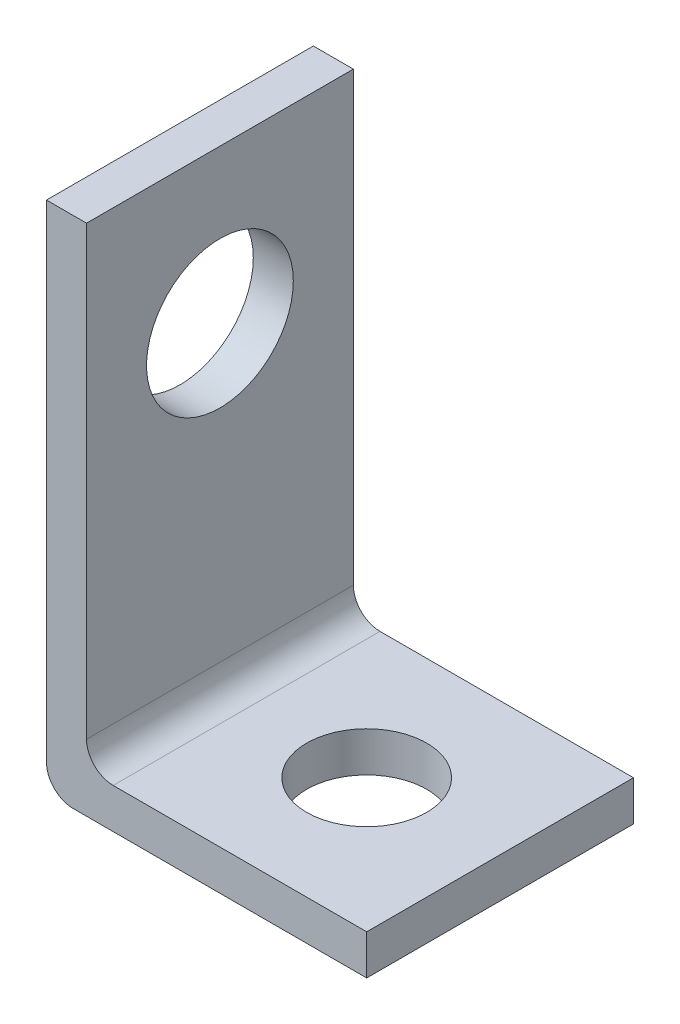
ISO-10303-21;
HEADER;
FILE_DESCRIPTION(('STEP AP214'),'2;1');
FILE_NAME('part.step','',(''),(''),'','','');
FILE_SCHEMA(('AUTOMOTIVE_DESIGN { 1 0 10303 214 1 1 1 1 }'));
ENDSEC;
DATA;
#1=APPLICATION_CONTEXT('core data for automotive mechanical design processes');
#2=APPLICATION_PROTOCOL_DEFINITION('international standard','automotive_design',2000,#1);
#3=PRODUCT_CONTEXT('',#1,'mechanical');
#4=PRODUCT('Part','Part','',(#3));
#5=PRODUCT_RELATED_PRODUCT_CATEGORY('part','',(#4));
#6=PRODUCT_DEFINITION_FORMATION('','',#4);
#7=PRODUCT_DEFINITION_CONTEXT('part definition',#1,'design');
#8=PRODUCT_DEFINITION('design','',#6,#7);
#9=PRODUCT_DEFINITION_SHAPE('','',#8);
#10=(LENGTH_UNIT() NAMED_UNIT(*) SI_UNIT(.MILLI.,.METRE.));
#11=(NAMED_UNIT(*) PLANE_ANGLE_UNIT() SI_UNIT($,.RADIAN.));
#12=(NAMED_UNIT(*) SI_UNIT($,.STERADIAN.) SOLID_ANGLE_UNIT());
#13=UNCERTAINTY_MEASURE_WITH_UNIT(LENGTH_MEASURE(1.E-05),#10,'distance_accuracy_value','');
#14=(GEOMETRIC_REPRESENTATION_CONTEXT(3) GLOBAL_UNCERTAINTY_ASSIGNED_CONTEXT((#13)) GLOBAL_UNIT_ASSIGNED_CONTEXT((#10,
#11,#12)) REPRESENTATION_CONTEXT('',''));
#15=CARTESIAN_POINT('',(0.,0.,0.));
#16=DIRECTION('',(0.,0.,1.));
#17=DIRECTION('',(1.,0.,0.));
#18=AXIS2_PLACEMENT_3D('',#15,#16,#17);
#19=CARTESIAN_POINT('',(0.,17.75,5.));
#20=DIRECTION('',(-1.,0.,0.));
#21=DIRECTION('',(0.,0.,1.));
#22=AXIS2_PLACEMENT_3D('',#19,#20,#21);
#23=PLANE('',#22);
#24=CARTESIAN_POINT('',(0.,12.,0.));
#25=DIRECTION('',(1.,0.,0.));
#26=DIRECTION('',(0.,0.,-1.));
#27=AXIS2_PLACEMENT_3D('',#24,#25,#26);
#28=CIRCLE('',#27,2.75);
#29=CARTESIAN_POINT('',(0.,12.,-2.75));
#30=VERTEX_POINT('',#29);
#31=EDGE_CURVE('E198',#30,#30,#28,.T.);
#32=ORIENTED_EDGE('',*,*,#31,.F.);
#33=EDGE_LOOP('',(#32));
#34=FACE_BOUND('',#33,.T.);
#35=DIRECTION('',(0.,1.,0.));
#36=VECTOR('',#35,1.);
#37=CARTESIAN_POINT('',(0.,17.75,5.));
#38=LINE('',#37,#36);
#39=CARTESIAN_POINT('',(0.,1.,5.));
#40=VERTEX_POINT('',#39);
#41=CARTESIAN_POINT('',(0.,17.75,5.));
#42=VERTEX_POINT('',#41);
#43=EDGE_CURVE('E95',#40,#42,#38,.T.);
#44=ORIENTED_EDGE('',*,*,#43,.F.);
#45=DIRECTION('',(0.,0.,-1.));
#46=VECTOR('',#45,1.);
#47=CARTESIAN_POINT('',(0.,1.,-5.));
#48=LINE('',#47,#46);
#49=CARTESIAN_POINT('',(0.,1.,-5.));
#50=VERTEX_POINT('',#49);
#51=EDGE_CURVE('E133',#40,#50,#48,.T.);
#52=ORIENTED_EDGE('',*,*,#51,.T.);
#53=DIRECTION('',(0.,1.,0.));
#54=VECTOR('',#53,1.);
#55=CARTESIAN_POINT('',(0.,17.75,-5.));
#56=LINE('',#55,#54);
#57=CARTESIAN_POINT('',(0.,17.75,-5.));
#58=VERTEX_POINT('',#57);
#59=EDGE_CURVE('E117',#50,#58,#56,.T.);
#60=ORIENTED_EDGE('',*,*,#59,.T.);
#61=DIRECTION('',(0.,0.,-1.));
#62=VECTOR('',#61,1.);
#63=CARTESIAN_POINT('',(0.,17.75,5.));
#64=LINE('',#63,#62);
#65=EDGE_CURVE('E110',#42,#58,#64,.T.);
#66=ORIENTED_EDGE('',*,*,#65,.F.);
#67=EDGE_LOOP('',(#44,#52,#60,#66));
#68=FACE_BOUND('',#67,.T.);
#69=ADVANCED_FACE('F33',(#34,#68),#23,.F.);
#70=CARTESIAN_POINT('',(-1.5,17.75,5.));
#71=DIRECTION('',(0.,-1.,0.));
#72=DIRECTION('',(0.,0.,-1.));
#73=AXIS2_PLACEMENT_3D('',#70,#71,#72);
#74=PLANE('',#73);
#75=DIRECTION('',(-1.,0.,0.));
#76=VECTOR('',#75,1.);
#77=CARTESIAN_POINT('',(-1.5,17.75,-5.));
#78=LINE('',#77,#76);
#79=CARTESIAN_POINT('',(-1.5,17.75,-5.));
#80=VERTEX_POINT('',#79);
#81=EDGE_CURVE('E214',#58,#80,#78,.T.);
#82=ORIENTED_EDGE('',*,*,#81,.T.);
#83=DIRECTION('',(0.,0.,-1.));
#84=VECTOR('',#83,1.);
#85=CARTESIAN_POINT('',(-1.5,17.75,5.));
#86=LINE('',#85,#84);
#87=CARTESIAN_POINT('',(-1.5,17.75,5.));
#88=VERTEX_POINT('',#87);
#89=EDGE_CURVE('E112',#88,#80,#86,.T.);
#90=ORIENTED_EDGE('',*,*,#89,.F.);
#91=DIRECTION('',(-1.,0.,0.));
#92=VECTOR('',#91,1.);
#93=CARTESIAN_POINT('',(-1.5,17.75,5.));
#94=LINE('',#93,#92);
#95=EDGE_CURVE('E99',#42,#88,#94,.T.);
#96=ORIENTED_EDGE('',*,*,#95,.F.);
#97=ORIENTED_EDGE('',*,*,#65,.T.);
#98=EDGE_LOOP('',(#82,#90,#96,#97));
#99=FACE_BOUND('',#98,.T.);
#100=ADVANCED_FACE('F109',(#99),#74,.F.);
#101=CARTESIAN_POINT('',(-1.5,-1.5,5.));
#102=DIRECTION('',(1.,0.,0.));
#103=DIRECTION('',(0.,1.,0.));
#104=AXIS2_PLACEMENT_3D('',#101,#102,#103);
#105=PLANE('',#104);
#106=CARTESIAN_POINT('',(-1.5,12.,0.));
#107=DIRECTION('',(1.,0.,0.));
#108=DIRECTION('',(0.,0.,-1.));
#109=AXIS2_PLACEMENT_3D('',#106,#107,#108);
#110=CIRCLE('',#109,2.75);
#111=CARTESIAN_POINT('',(-1.5,12.,-2.75));
#112=VERTEX_POINT('',#111);
#113=EDGE_CURVE('E203',#112,#112,#110,.T.);
#114=ORIENTED_EDGE('',*,*,#113,.T.);
#115=EDGE_LOOP('',(#114));
#116=FACE_BOUND('',#115,.T.);
#117=DIRECTION('',(0.,-1.,0.));
#118=VECTOR('',#117,1.);
#119=CARTESIAN_POINT('',(-1.5,-1.5,-5.));
#120=LINE('',#119,#118);
#121=CARTESIAN_POINT('',(-1.5,-0.500000000000001,-5.));
#122=VERTEX_POINT('',#121);
#123=EDGE_CURVE('E216',#80,#122,#120,.T.);
#124=ORIENTED_EDGE('',*,*,#123,.T.);
#125=DIRECTION('',(0.,0.,-1.));
#126=VECTOR('',#125,1.);
#127=CARTESIAN_POINT('',(-1.5,-0.500000000000001,5.));
#128=LINE('',#127,#126);
#129=CARTESIAN_POINT('',(-1.5,-0.500000000000001,5.));
#130=VERTEX_POINT('',#129);
#131=EDGE_CURVE('E129',#122,#130,#128,.F.);
#132=ORIENTED_EDGE('',*,*,#131,.T.);
#133=DIRECTION('',(0.,-1.,0.));
#134=VECTOR('',#133,1.);
#135=CARTESIAN_POINT('',(-1.5,-1.5,5.));
#136=LINE('',#135,#134);
#137=EDGE_CURVE('E114',#88,#130,#136,.T.);
#138=ORIENTED_EDGE('',*,*,#137,.F.);
#139=ORIENTED_EDGE('',*,*,#89,.T.);
#140=EDGE_LOOP('',(#124,#132,#138,#139));
#141=FACE_BOUND('',#140,.T.);
#142=ADVANCED_FACE('F164',(#116,#141),#105,.F.);
#143=CARTESIAN_POINT('',(10.5,-1.5,5.));
#144=DIRECTION('',(0.,1.,0.));
#145=DIRECTION('',(-1.,0.,0.));
#146=AXIS2_PLACEMENT_3D('',#143,#144,#145);
#147=PLANE('',#146);
#148=CARTESIAN_POINT('',(5.5,-1.5,0.));
#149=DIRECTION('',(0.,1.,0.));
#150=DIRECTION('',(0.,0.,1.));
#151=AXIS2_PLACEMENT_3D('',#148,#149,#150);
#152=CIRCLE('',#151,2.25);
#153=CARTESIAN_POINT('',(5.5,-1.5,2.25));
#154=VERTEX_POINT('',#153);
#155=EDGE_CURVE('E193',#154,#154,#152,.T.);
#156=ORIENTED_EDGE('',*,*,#155,.T.);
#157=EDGE_LOOP('',(#156));
#158=FACE_BOUND('',#157,.T.);
#159=DIRECTION('',(1.,0.,0.));
#160=VECTOR('',#159,1.);
#161=CARTESIAN_POINT('',(10.5,-1.5,5.));
#162=LINE('',#161,#160);
#163=CARTESIAN_POINT('',(-0.499999999999999,-1.5,5.));
#164=VERTEX_POINT('',#163);
#165=CARTESIAN_POINT('',(10.5,-1.5,5.));
#166=VERTEX_POINT('',#165);
#167=EDGE_CURVE('E207',#164,#166,#162,.T.);
#168=ORIENTED_EDGE('',*,*,#167,.F.);
#169=DIRECTION('',(0.,0.,-1.));
#170=VECTOR('',#169,1.);
#171=CARTESIAN_POINT('',(-0.499999999999999,-1.5,5.));
#172=LINE('',#171,#170);
#173=CARTESIAN_POINT('',(-0.499999999999999,-1.5,-5.));
#174=VERTEX_POINT('',#173);
#175=EDGE_CURVE('E119',#164,#174,#172,.T.);
#176=ORIENTED_EDGE('',*,*,#175,.T.);
#177=DIRECTION('',(1.,0.,0.));
#178=VECTOR('',#177,1.);
#179=CARTESIAN_POINT('',(10.5,-1.5,-5.));
#180=LINE('',#179,#178);
#181=CARTESIAN_POINT('',(10.5,-1.5,-5.));
#182=VERTEX_POINT('',#181);
#183=EDGE_CURVE('E219',#174,#182,#180,.T.);
#184=ORIENTED_EDGE('',*,*,#183,.T.);
#185=DIRECTION('',(0.,0.,-1.));
#186=VECTOR('',#185,1.);
#187=CARTESIAN_POINT('',(10.5,-1.5,5.));
#188=LINE('',#187,#186);
#189=EDGE_CURVE('E124',#166,#182,#188,.T.);
#190=ORIENTED_EDGE('',*,*,#189,.F.);
#191=EDGE_LOOP('',(#168,#176,#184,#190));
#192=FACE_BOUND('',#191,.T.);
#193=ADVANCED_FACE('F170',(#158,#192),#147,.F.);
#194=CARTESIAN_POINT('',(10.5,0.,5.));
#195=DIRECTION('',(-1.,0.,0.));
#196=DIRECTION('',(0.,0.,1.));
#197=AXIS2_PLACEMENT_3D('',#194,#195,#196);
#198=PLANE('',#197);
#199=DIRECTION('',(0.,1.,0.));
#200=VECTOR('',#199,1.);
#201=CARTESIAN_POINT('',(10.5,0.,-5.));
#202=LINE('',#201,#200);
#203=CARTESIAN_POINT('',(10.5,0.,-5.));
#204=VERTEX_POINT('',#203);
#205=EDGE_CURVE('E145',#182,#204,#202,.T.);
#206=ORIENTED_EDGE('',*,*,#205,.T.);
#207=DIRECTION('',(0.,0.,-1.));
#208=VECTOR('',#207,1.);
#209=CARTESIAN_POINT('',(10.5,0.,5.));
#210=LINE('',#209,#208);
#211=CARTESIAN_POINT('',(10.5,0.,5.));
#212=VERTEX_POINT('',#211);
#213=EDGE_CURVE('E144',#212,#204,#210,.T.);
#214=ORIENTED_EDGE('',*,*,#213,.F.);
#215=DIRECTION('',(0.,1.,0.));
#216=VECTOR('',#215,1.);
#217=CARTESIAN_POINT('',(10.5,0.,5.));
#218=LINE('',#217,#216);
#219=EDGE_CURVE('E209',#166,#212,#218,.T.);
#220=ORIENTED_EDGE('',*,*,#219,.F.);
#221=ORIENTED_EDGE('',*,*,#189,.T.);
#222=EDGE_LOOP('',(#206,#214,#220,#221));
#223=FACE_BOUND('',#222,.T.);
#224=ADVANCED_FACE('F174',(#223),#198,.F.);
#225=CARTESIAN_POINT('',(0.,0.,5.));
#226=DIRECTION('',(0.,-1.,0.));
#227=DIRECTION('',(0.,0.,-1.));
#228=AXIS2_PLACEMENT_3D('',#225,#226,#227);
#229=PLANE('',#228);
#230=CARTESIAN_POINT('',(5.5,0.,0.));
#231=DIRECTION('',(0.,1.,0.));
#232=DIRECTION('',(0.,0.,1.));
#233=AXIS2_PLACEMENT_3D('',#230,#231,#232);
#234=CIRCLE('',#233,2.25);
#235=CARTESIAN_POINT('',(5.5,0.,2.25));
#236=VERTEX_POINT('',#235);
#237=EDGE_CURVE('E196',#236,#236,#234,.T.);
#238=ORIENTED_EDGE('',*,*,#237,.F.);
#239=EDGE_LOOP('',(#238));
#240=FACE_BOUND('',#239,.T.);
#241=DIRECTION('',(-1.,0.,0.));
#242=VECTOR('',#241,1.);
#243=CARTESIAN_POINT('',(0.,0.,-5.));
#244=LINE('',#243,#242);
#245=CARTESIAN_POINT('',(1.,0.,-5.));
#246=VERTEX_POINT('',#245);
#247=EDGE_CURVE('E105',#204,#246,#244,.T.);
#248=ORIENTED_EDGE('',*,*,#247,.T.);
#249=DIRECTION('',(0.,0.,-1.));
#250=VECTOR('',#249,1.);
#251=CARTESIAN_POINT('',(1.,0.,5.));
#252=LINE('',#251,#250);
#253=CARTESIAN_POINT('',(1.,0.,5.));
#254=VERTEX_POINT('',#253);
#255=EDGE_CURVE('E48',#246,#254,#252,.F.);
#256=ORIENTED_EDGE('',*,*,#255,.T.);
#257=DIRECTION('',(-1.,0.,0.));
#258=VECTOR('',#257,1.);
#259=CARTESIAN_POINT('',(0.,0.,5.));
#260=LINE('',#259,#258);
#261=EDGE_CURVE('E211',#212,#254,#260,.T.);
#262=ORIENTED_EDGE('',*,*,#261,.F.);
#263=ORIENTED_EDGE('',*,*,#213,.T.);
#264=EDGE_LOOP('',(#248,#256,#262,#263));
#265=FACE_BOUND('',#264,.T.);
#266=ADVANCED_FACE('F142',(#240,#265),#229,.F.);
#267=CARTESIAN_POINT('',(0.,0.,5.));
#268=DIRECTION('',(0.,0.,1.));
#269=DIRECTION('',(1.,0.,0.));
#270=AXIS2_PLACEMENT_3D('',#267,#268,#269);
#271=PLANE('',#270);
#272=ORIENTED_EDGE('',*,*,#137,.T.);
#273=CARTESIAN_POINT('',(-0.499999999999999,-0.500000000000001,5.));
#274=DIRECTION('',(0.,0.,1.));
#275=DIRECTION('',(1.,0.,0.));
#276=AXIS2_PLACEMENT_3D('',#273,#274,#275);
#277=CIRCLE('',#276,1.);
#278=EDGE_CURVE('E131',#130,#164,#277,.T.);
#279=ORIENTED_EDGE('',*,*,#278,.T.);
#280=ORIENTED_EDGE('',*,*,#167,.T.);
#281=ORIENTED_EDGE('',*,*,#219,.T.);
#282=ORIENTED_EDGE('',*,*,#261,.T.);
#283=CARTESIAN_POINT('',(1.,1.,5.));
#284=DIRECTION('',(0.,0.,1.));
#285=DIRECTION('',(1.,0.,0.));
#286=AXIS2_PLACEMENT_3D('',#283,#284,#285);
#287=CIRCLE('',#286,1.);
#288=EDGE_CURVE('E11',#254,#40,#287,.F.);
#289=ORIENTED_EDGE('',*,*,#288,.T.);
#290=ORIENTED_EDGE('',*,*,#43,.T.);
#291=ORIENTED_EDGE('',*,*,#95,.T.);
#292=EDGE_LOOP('',(#272,#279,#280,#281,#282,#289,#290,#291));
#293=FACE_BOUND('',#292,.T.);
#294=ADVANCED_FACE('F98',(#293),#271,.T.);
#295=CARTESIAN_POINT('',(0.,0.,-5.));
#296=DIRECTION('',(0.,0.,1.));
#297=DIRECTION('',(1.,0.,0.));
#298=AXIS2_PLACEMENT_3D('',#295,#296,#297);
#299=PLANE('',#298);
#300=ORIENTED_EDGE('',*,*,#183,.F.);
#301=CARTESIAN_POINT('',(-0.499999999999999,-0.500000000000001,-5.));
#302=DIRECTION('',(0.,0.,1.));
#303=DIRECTION('',(1.,0.,0.));
#304=AXIS2_PLACEMENT_3D('',#301,#302,#303);
#305=CIRCLE('',#304,1.);
#306=EDGE_CURVE('E122',#174,#122,#305,.F.);
#307=ORIENTED_EDGE('',*,*,#306,.T.);
#308=ORIENTED_EDGE('',*,*,#123,.F.);
#309=ORIENTED_EDGE('',*,*,#81,.F.);
#310=ORIENTED_EDGE('',*,*,#59,.F.);
#311=CARTESIAN_POINT('',(1.,1.,-5.));
#312=DIRECTION('',(0.,0.,1.));
#313=DIRECTION('',(1.,0.,0.));
#314=AXIS2_PLACEMENT_3D('',#311,#312,#313);
#315=CIRCLE('',#314,1.);
#316=EDGE_CURVE('E41',#50,#246,#315,.T.);
#317=ORIENTED_EDGE('',*,*,#316,.T.);
#318=ORIENTED_EDGE('',*,*,#247,.F.);
#319=ORIENTED_EDGE('',*,*,#205,.F.);
#320=EDGE_LOOP('',(#300,#307,#308,#309,#310,#317,#318,#319));
#321=FACE_BOUND('',#320,.T.);
#322=ADVANCED_FACE('F138',(#321),#299,.F.);
#323=CARTESIAN_POINT('',(-0.499999999999999,-0.500000000000001,5.));
#324=DIRECTION('',(0.,0.,-1.));
#325=DIRECTION('',(-1.,0.,0.));
#326=AXIS2_PLACEMENT_3D('',#323,#324,#325);
#327=CYLINDRICAL_SURFACE('',#326,1.);
#328=ORIENTED_EDGE('',*,*,#278,.F.);
#329=ORIENTED_EDGE('',*,*,#131,.F.);
#330=ORIENTED_EDGE('',*,*,#306,.F.);
#331=ORIENTED_EDGE('',*,*,#175,.F.);
#332=EDGE_LOOP('',(#328,#329,#330,#331));
#333=FACE_BOUND('',#332,.T.);
#334=ADVANCED_FACE('F149',(#333),#327,.T.);
#335=CARTESIAN_POINT('',(1.,1.,5.));
#336=DIRECTION('',(0.,0.,1.));
#337=DIRECTION('',(1.,0.,0.));
#338=AXIS2_PLACEMENT_3D('',#335,#336,#337);
#339=CYLINDRICAL_SURFACE('',#338,1.);
#340=ORIENTED_EDGE('',*,*,#288,.F.);
#341=ORIENTED_EDGE('',*,*,#255,.F.);
#342=ORIENTED_EDGE('',*,*,#316,.F.);
#343=ORIENTED_EDGE('',*,*,#51,.F.);
#344=EDGE_LOOP('',(#340,#341,#342,#343));
#345=FACE_BOUND('',#344,.T.);
#346=ADVANCED_FACE('F35',(#345),#339,.F.);
#347=CARTESIAN_POINT('',(0.,12.,0.));
#348=DIRECTION('',(1.,0.,0.));
#349=DIRECTION('',(0.,0.,-1.));
#350=AXIS2_PLACEMENT_3D('',#347,#348,#349);
#351=CYLINDRICAL_SURFACE('',#350,2.75);
#352=ORIENTED_EDGE('',*,*,#113,.F.);
#353=EDGE_LOOP('',(#352));
#354=FACE_BOUND('',#353,.T.);
#355=ORIENTED_EDGE('',*,*,#31,.T.);
#356=EDGE_LOOP('',(#355));
#357=FACE_BOUND('',#356,.T.);
#358=ADVANCED_FACE('F148',(#354,#357),#351,.F.);
#359=CARTESIAN_POINT('',(5.5,0.,0.));
#360=DIRECTION('',(0.,1.,0.));
#361=DIRECTION('',(0.,0.,1.));
#362=AXIS2_PLACEMENT_3D('',#359,#360,#361);
#363=CYLINDRICAL_SURFACE('',#362,2.25);
#364=ORIENTED_EDGE('',*,*,#155,.F.);
#365=EDGE_LOOP('',(#364));
#366=FACE_BOUND('',#365,.T.);
#367=ORIENTED_EDGE('',*,*,#237,.T.);
#368=EDGE_LOOP('',(#367));
#369=FACE_BOUND('',#368,.T.);
#370=ADVANCED_FACE('F154',(#366,#369),#363,.F.);
#371=CLOSED_SHELL('',(#69,#100,#142,#193,#224,#266,#294,#322,#334,#346,#358,#370));
#372=MANIFOLD_SOLID_BREP('B2',#371);
#373=ADVANCED_BREP_SHAPE_REPRESENTATION('',(#18,#372),#14);
#374=SHAPE_DEFINITION_REPRESENTATION(#9,#373);
ENDSEC;
END-ISO-10303-21;
